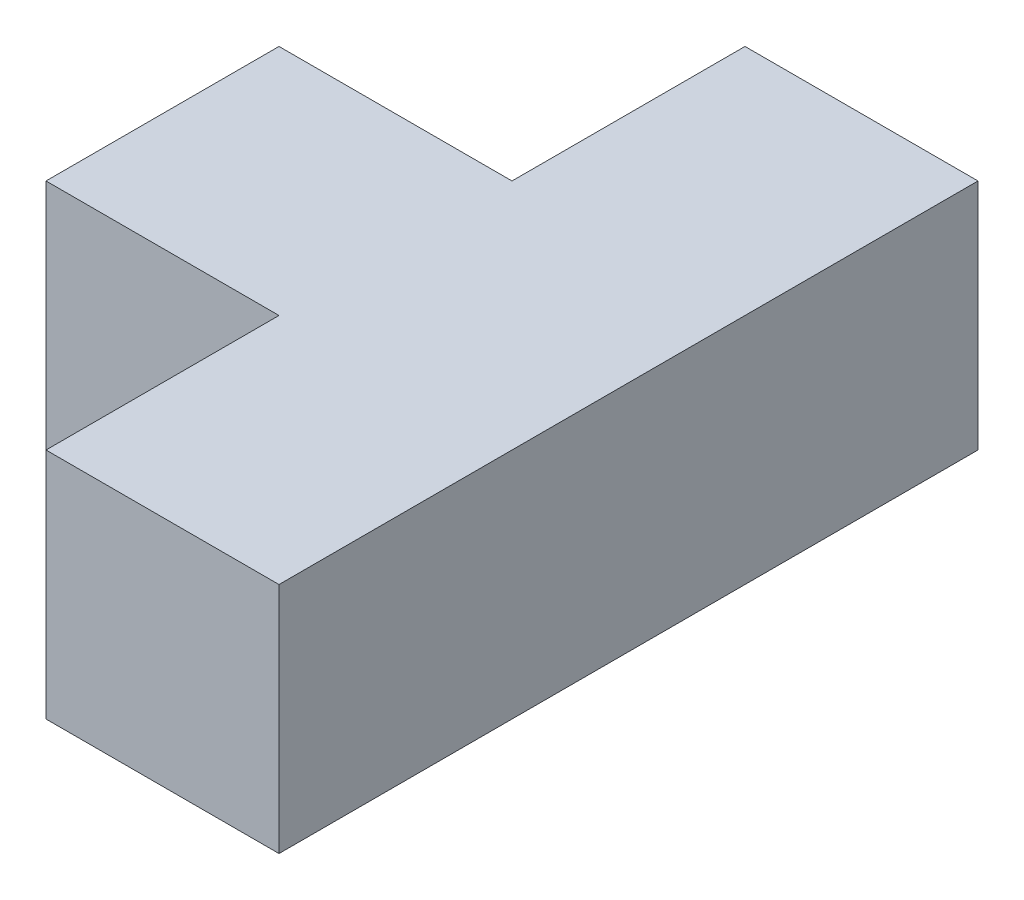
ISO-10303-21;
HEADER;
FILE_DESCRIPTION(('STEP AP214'),'2;1');
FILE_NAME('part.step','',(''),(''),'','','');
FILE_SCHEMA(('AUTOMOTIVE_DESIGN { 1 0 10303 214 1 1 1 1 }'));
ENDSEC;
DATA;
#1=APPLICATION_CONTEXT('core data for automotive mechanical design processes');
#2=APPLICATION_PROTOCOL_DEFINITION('international standard','automotive_design',2000,#1);
#3=PRODUCT_CONTEXT('',#1,'mechanical');
#4=PRODUCT('Part','Part','',(#3));
#5=PRODUCT_RELATED_PRODUCT_CATEGORY('part','',(#4));
#6=PRODUCT_DEFINITION_FORMATION('','',#4);
#7=PRODUCT_DEFINITION_CONTEXT('part definition',#1,'design');
#8=PRODUCT_DEFINITION('design','',#6,#7);
#9=PRODUCT_DEFINITION_SHAPE('','',#8);
#10=(LENGTH_UNIT() NAMED_UNIT(*) SI_UNIT(.MILLI.,.METRE.));
#11=(NAMED_UNIT(*) PLANE_ANGLE_UNIT() SI_UNIT($,.RADIAN.));
#12=(NAMED_UNIT(*) SI_UNIT($,.STERADIAN.) SOLID_ANGLE_UNIT());
#13=UNCERTAINTY_MEASURE_WITH_UNIT(LENGTH_MEASURE(1.E-05),#10,'distance_accuracy_value','');
#14=(GEOMETRIC_REPRESENTATION_CONTEXT(3) GLOBAL_UNCERTAINTY_ASSIGNED_CONTEXT((#13)) GLOBAL_UNIT_ASSIGNED_CONTEXT((#10,
#11,#12)) REPRESENTATION_CONTEXT('',''));
#15=CARTESIAN_POINT('',(0.,0.,0.));
#16=DIRECTION('',(0.,0.,1.));
#17=DIRECTION('',(1.,0.,0.));
#18=AXIS2_PLACEMENT_3D('',#15,#16,#17);
#19=CARTESIAN_POINT('',(-30.,30.,0.));
#20=DIRECTION('',(0.,0.,1.));
#21=DIRECTION('',(1.,0.,0.));
#22=AXIS2_PLACEMENT_3D('',#19,#20,#21);
#23=PLANE('',#22);
#24=DIRECTION('',(-1.,0.,0.));
#25=VECTOR('',#24,1.);
#26=CARTESIAN_POINT('',(-30.,0.,0.));
#27=LINE('',#26,#25);
#28=CARTESIAN_POINT('',(0.,0.,0.));
#29=VERTEX_POINT('',#28);
#30=CARTESIAN_POINT('',(-30.,0.,0.));
#31=VERTEX_POINT('',#30);
#32=EDGE_CURVE('E129',#29,#31,#27,.T.);
#33=ORIENTED_EDGE('',*,*,#32,.T.);
#34=DIRECTION('',(0.,-1.,0.));
#35=VECTOR('',#34,1.);
#36=CARTESIAN_POINT('',(-30.,30.,0.));
#37=LINE('',#36,#35);
#38=CARTESIAN_POINT('',(-30.,30.,0.));
#39=VERTEX_POINT('',#38);
#40=EDGE_CURVE('E11',#39,#31,#37,.T.);
#41=ORIENTED_EDGE('',*,*,#40,.F.);
#42=DIRECTION('',(-1.,0.,0.));
#43=VECTOR('',#42,1.);
#44=CARTESIAN_POINT('',(-30.,30.,0.));
#45=LINE('',#44,#43);
#46=CARTESIAN_POINT('',(0.,30.,0.));
#47=VERTEX_POINT('',#46);
#48=EDGE_CURVE('E143',#47,#39,#45,.T.);
#49=ORIENTED_EDGE('',*,*,#48,.F.);
#50=DIRECTION('',(0.,-1.,0.));
#51=VECTOR('',#50,1.);
#52=CARTESIAN_POINT('',(0.,30.,0.));
#53=LINE('',#52,#51);
#54=EDGE_CURVE('E125',#47,#29,#53,.T.);
#55=ORIENTED_EDGE('',*,*,#54,.T.);
#56=EDGE_LOOP('',(#33,#41,#49,#55));
#57=FACE_BOUND('',#56,.T.);
#58=ADVANCED_FACE('F33',(#57),#23,.F.);
#59=CARTESIAN_POINT('',(-30.,30.,30.));
#60=DIRECTION('',(1.,0.,0.));
#61=DIRECTION('',(0.,0.,-1.));
#62=AXIS2_PLACEMENT_3D('',#59,#60,#61);
#63=PLANE('',#62);
#64=DIRECTION('',(0.,0.,1.));
#65=VECTOR('',#64,1.);
#66=CARTESIAN_POINT('',(-30.,0.,30.));
#67=LINE('',#66,#65);
#68=CARTESIAN_POINT('',(-30.,0.,30.));
#69=VERTEX_POINT('',#68);
#70=EDGE_CURVE('E132',#31,#69,#67,.T.);
#71=ORIENTED_EDGE('',*,*,#70,.T.);
#72=DIRECTION('',(0.,-1.,0.));
#73=VECTOR('',#72,1.);
#74=CARTESIAN_POINT('',(-30.,30.,30.));
#75=LINE('',#74,#73);
#76=CARTESIAN_POINT('',(-30.,30.,30.));
#77=VERTEX_POINT('',#76);
#78=EDGE_CURVE('E41',#77,#69,#75,.T.);
#79=ORIENTED_EDGE('',*,*,#78,.F.);
#80=DIRECTION('',(0.,0.,1.));
#81=VECTOR('',#80,1.);
#82=CARTESIAN_POINT('',(-30.,30.,30.));
#83=LINE('',#82,#81);
#84=EDGE_CURVE('E92',#39,#77,#83,.T.);
#85=ORIENTED_EDGE('',*,*,#84,.F.);
#86=ORIENTED_EDGE('',*,*,#40,.T.);
#87=EDGE_LOOP('',(#71,#79,#85,#86));
#88=FACE_BOUND('',#87,.T.);
#89=ADVANCED_FACE('F178',(#88),#63,.F.);
#90=CARTESIAN_POINT('',(0.,30.,30.));
#91=DIRECTION('',(0.,0.,-1.));
#92=DIRECTION('',(-1.,0.,0.));
#93=AXIS2_PLACEMENT_3D('',#90,#91,#92);
#94=PLANE('',#93);
#95=DIRECTION('',(1.,0.,0.));
#96=VECTOR('',#95,1.);
#97=CARTESIAN_POINT('',(0.,0.,30.));
#98=LINE('',#97,#96);
#99=CARTESIAN_POINT('',(0.,0.,30.));
#100=VERTEX_POINT('',#99);
#101=EDGE_CURVE('E134',#69,#100,#98,.T.);
#102=ORIENTED_EDGE('',*,*,#101,.T.);
#103=DIRECTION('',(0.,-1.,0.));
#104=VECTOR('',#103,1.);
#105=CARTESIAN_POINT('',(0.,30.,30.));
#106=LINE('',#105,#104);
#107=CARTESIAN_POINT('',(0.,30.,30.));
#108=VERTEX_POINT('',#107);
#109=EDGE_CURVE('E150',#108,#100,#106,.T.);
#110=ORIENTED_EDGE('',*,*,#109,.F.);
#111=DIRECTION('',(1.,0.,0.));
#112=VECTOR('',#111,1.);
#113=CARTESIAN_POINT('',(0.,30.,30.));
#114=LINE('',#113,#112);
#115=EDGE_CURVE('E158',#77,#108,#114,.T.);
#116=ORIENTED_EDGE('',*,*,#115,.F.);
#117=ORIENTED_EDGE('',*,*,#78,.T.);
#118=EDGE_LOOP('',(#102,#110,#116,#117));
#119=FACE_BOUND('',#118,.T.);
#120=ADVANCED_FACE('F156',(#119),#94,.F.);
#121=CARTESIAN_POINT('',(0.,30.,60.));
#122=DIRECTION('',(1.,0.,0.));
#123=DIRECTION('',(0.,0.,-1.));
#124=AXIS2_PLACEMENT_3D('',#121,#122,#123);
#125=PLANE('',#124);
#126=DIRECTION('',(0.,0.,1.));
#127=VECTOR('',#126,1.);
#128=CARTESIAN_POINT('',(0.,0.,60.));
#129=LINE('',#128,#127);
#130=CARTESIAN_POINT('',(0.,0.,60.));
#131=VERTEX_POINT('',#130);
#132=EDGE_CURVE('E136',#100,#131,#129,.T.);
#133=ORIENTED_EDGE('',*,*,#132,.T.);
#134=DIRECTION('',(0.,-1.,0.));
#135=VECTOR('',#134,1.);
#136=CARTESIAN_POINT('',(0.,30.,60.));
#137=LINE('',#136,#135);
#138=CARTESIAN_POINT('',(0.,30.,60.));
#139=VERTEX_POINT('',#138);
#140=EDGE_CURVE('E147',#139,#131,#137,.T.);
#141=ORIENTED_EDGE('',*,*,#140,.F.);
#142=DIRECTION('',(0.,0.,1.));
#143=VECTOR('',#142,1.);
#144=CARTESIAN_POINT('',(0.,30.,60.));
#145=LINE('',#144,#143);
#146=EDGE_CURVE('E170',#108,#139,#145,.T.);
#147=ORIENTED_EDGE('',*,*,#146,.F.);
#148=ORIENTED_EDGE('',*,*,#109,.T.);
#149=EDGE_LOOP('',(#133,#141,#147,#148));
#150=FACE_BOUND('',#149,.T.);
#151=ADVANCED_FACE('F166',(#150),#125,.F.);
#152=CARTESIAN_POINT('',(30.,30.,60.));
#153=DIRECTION('',(0.,0.,-1.));
#154=DIRECTION('',(-1.,0.,0.));
#155=AXIS2_PLACEMENT_3D('',#152,#153,#154);
#156=PLANE('',#155);
#157=DIRECTION('',(1.,0.,0.));
#158=VECTOR('',#157,1.);
#159=CARTESIAN_POINT('',(30.,0.,60.));
#160=LINE('',#159,#158);
#161=CARTESIAN_POINT('',(30.,0.,60.));
#162=VERTEX_POINT('',#161);
#163=EDGE_CURVE('E138',#131,#162,#160,.T.);
#164=ORIENTED_EDGE('',*,*,#163,.T.);
#165=DIRECTION('',(0.,-1.,0.));
#166=VECTOR('',#165,1.);
#167=CARTESIAN_POINT('',(30.,30.,60.));
#168=LINE('',#167,#166);
#169=CARTESIAN_POINT('',(30.,30.,60.));
#170=VERTEX_POINT('',#169);
#171=EDGE_CURVE('E120',#170,#162,#168,.T.);
#172=ORIENTED_EDGE('',*,*,#171,.F.);
#173=DIRECTION('',(1.,0.,0.));
#174=VECTOR('',#173,1.);
#175=CARTESIAN_POINT('',(30.,30.,60.));
#176=LINE('',#175,#174);
#177=EDGE_CURVE('E111',#139,#170,#176,.T.);
#178=ORIENTED_EDGE('',*,*,#177,.F.);
#179=ORIENTED_EDGE('',*,*,#140,.T.);
#180=EDGE_LOOP('',(#164,#172,#178,#179));
#181=FACE_BOUND('',#180,.T.);
#182=ADVANCED_FACE('F169',(#181),#156,.F.);
#183=CARTESIAN_POINT('',(30.,30.,-30.));
#184=DIRECTION('',(-1.,0.,0.));
#185=DIRECTION('',(0.,0.,1.));
#186=AXIS2_PLACEMENT_3D('',#183,#184,#185);
#187=PLANE('',#186);
#188=DIRECTION('',(0.,0.,-1.));
#189=VECTOR('',#188,1.);
#190=CARTESIAN_POINT('',(30.,0.,-30.));
#191=LINE('',#190,#189);
#192=CARTESIAN_POINT('',(30.,0.,-30.));
#193=VERTEX_POINT('',#192);
#194=EDGE_CURVE('E119',#162,#193,#191,.T.);
#195=ORIENTED_EDGE('',*,*,#194,.T.);
#196=DIRECTION('',(0.,-1.,0.));
#197=VECTOR('',#196,1.);
#198=CARTESIAN_POINT('',(30.,30.,-30.));
#199=LINE('',#198,#197);
#200=CARTESIAN_POINT('',(30.,30.,-30.));
#201=VERTEX_POINT('',#200);
#202=EDGE_CURVE('E116',#201,#193,#199,.T.);
#203=ORIENTED_EDGE('',*,*,#202,.F.);
#204=DIRECTION('',(0.,0.,-1.));
#205=VECTOR('',#204,1.);
#206=CARTESIAN_POINT('',(30.,30.,-30.));
#207=LINE('',#206,#205);
#208=EDGE_CURVE('E105',#170,#201,#207,.T.);
#209=ORIENTED_EDGE('',*,*,#208,.F.);
#210=ORIENTED_EDGE('',*,*,#171,.T.);
#211=EDGE_LOOP('',(#195,#203,#209,#210));
#212=FACE_BOUND('',#211,.T.);
#213=ADVANCED_FACE('F117',(#212),#187,.F.);
#214=CARTESIAN_POINT('',(0.,30.,-30.));
#215=DIRECTION('',(0.,0.,1.));
#216=DIRECTION('',(1.,0.,0.));
#217=AXIS2_PLACEMENT_3D('',#214,#215,#216);
#218=PLANE('',#217);
#219=DIRECTION('',(-1.,0.,0.));
#220=VECTOR('',#219,1.);
#221=CARTESIAN_POINT('',(0.,0.,-30.));
#222=LINE('',#221,#220);
#223=CARTESIAN_POINT('',(0.,0.,-30.));
#224=VERTEX_POINT('',#223);
#225=EDGE_CURVE('E78',#193,#224,#222,.T.);
#226=ORIENTED_EDGE('',*,*,#225,.T.);
#227=DIRECTION('',(0.,-1.,0.));
#228=VECTOR('',#227,1.);
#229=CARTESIAN_POINT('',(0.,30.,-30.));
#230=LINE('',#229,#228);
#231=CARTESIAN_POINT('',(0.,30.,-30.));
#232=VERTEX_POINT('',#231);
#233=EDGE_CURVE('E121',#232,#224,#230,.T.);
#234=ORIENTED_EDGE('',*,*,#233,.F.);
#235=DIRECTION('',(-1.,0.,0.));
#236=VECTOR('',#235,1.);
#237=CARTESIAN_POINT('',(0.,30.,-30.));
#238=LINE('',#237,#236);
#239=EDGE_CURVE('E109',#201,#232,#238,.T.);
#240=ORIENTED_EDGE('',*,*,#239,.F.);
#241=ORIENTED_EDGE('',*,*,#202,.T.);
#242=EDGE_LOOP('',(#226,#234,#240,#241));
#243=FACE_BOUND('',#242,.T.);
#244=ADVANCED_FACE('F123',(#243),#218,.F.);
#245=CARTESIAN_POINT('',(0.,30.,0.));
#246=DIRECTION('',(1.,0.,0.));
#247=DIRECTION('',(0.,0.,-1.));
#248=AXIS2_PLACEMENT_3D('',#245,#246,#247);
#249=PLANE('',#248);
#250=DIRECTION('',(0.,0.,1.));
#251=VECTOR('',#250,1.);
#252=CARTESIAN_POINT('',(0.,0.,0.));
#253=LINE('',#252,#251);
#254=EDGE_CURVE('E84',#224,#29,#253,.T.);
#255=ORIENTED_EDGE('',*,*,#254,.T.);
#256=ORIENTED_EDGE('',*,*,#54,.F.);
#257=DIRECTION('',(0.,0.,1.));
#258=VECTOR('',#257,1.);
#259=CARTESIAN_POINT('',(0.,30.,0.));
#260=LINE('',#259,#258);
#261=EDGE_CURVE('E49',#232,#47,#260,.T.);
#262=ORIENTED_EDGE('',*,*,#261,.F.);
#263=ORIENTED_EDGE('',*,*,#233,.T.);
#264=EDGE_LOOP('',(#255,#256,#262,#263));
#265=FACE_BOUND('',#264,.T.);
#266=ADVANCED_FACE('F194',(#265),#249,.F.);
#267=CARTESIAN_POINT('',(0.,30.,0.));
#268=DIRECTION('',(0.,1.,0.));
#269=DIRECTION('',(0.,0.,1.));
#270=AXIS2_PLACEMENT_3D('',#267,#268,#269);
#271=PLANE('',#270);
#272=ORIENTED_EDGE('',*,*,#48,.T.);
#273=ORIENTED_EDGE('',*,*,#84,.T.);
#274=ORIENTED_EDGE('',*,*,#115,.T.);
#275=ORIENTED_EDGE('',*,*,#146,.T.);
#276=ORIENTED_EDGE('',*,*,#177,.T.);
#277=ORIENTED_EDGE('',*,*,#208,.T.);
#278=ORIENTED_EDGE('',*,*,#239,.T.);
#279=ORIENTED_EDGE('',*,*,#261,.T.);
#280=EDGE_LOOP('',(#272,#273,#274,#275,#276,#277,#278,#279));
#281=FACE_BOUND('',#280,.T.);
#282=ADVANCED_FACE('F107',(#281),#271,.T.);
#283=CARTESIAN_POINT('',(0.,0.,0.));
#284=DIRECTION('',(0.,1.,0.));
#285=DIRECTION('',(0.,0.,1.));
#286=AXIS2_PLACEMENT_3D('',#283,#284,#285);
#287=PLANE('',#286);
#288=ORIENTED_EDGE('',*,*,#32,.F.);
#289=ORIENTED_EDGE('',*,*,#254,.F.);
#290=ORIENTED_EDGE('',*,*,#225,.F.);
#291=ORIENTED_EDGE('',*,*,#194,.F.);
#292=ORIENTED_EDGE('',*,*,#163,.F.);
#293=ORIENTED_EDGE('',*,*,#132,.F.);
#294=ORIENTED_EDGE('',*,*,#101,.F.);
#295=ORIENTED_EDGE('',*,*,#70,.F.);
#296=EDGE_LOOP('',(#288,#289,#290,#291,#292,#293,#294,#295));
#297=FACE_BOUND('',#296,.T.);
#298=ADVANCED_FACE('F162',(#297),#287,.F.);
#299=CLOSED_SHELL('',(#58,#89,#120,#151,#182,#213,#244,#266,#282,#298));
#300=MANIFOLD_SOLID_BREP('B2',#299);
#301=ADVANCED_BREP_SHAPE_REPRESENTATION('',(#18,#300),#14);
#302=SHAPE_DEFINITION_REPRESENTATION(#9,#301);
ENDSEC;
END-ISO-10303-21;
